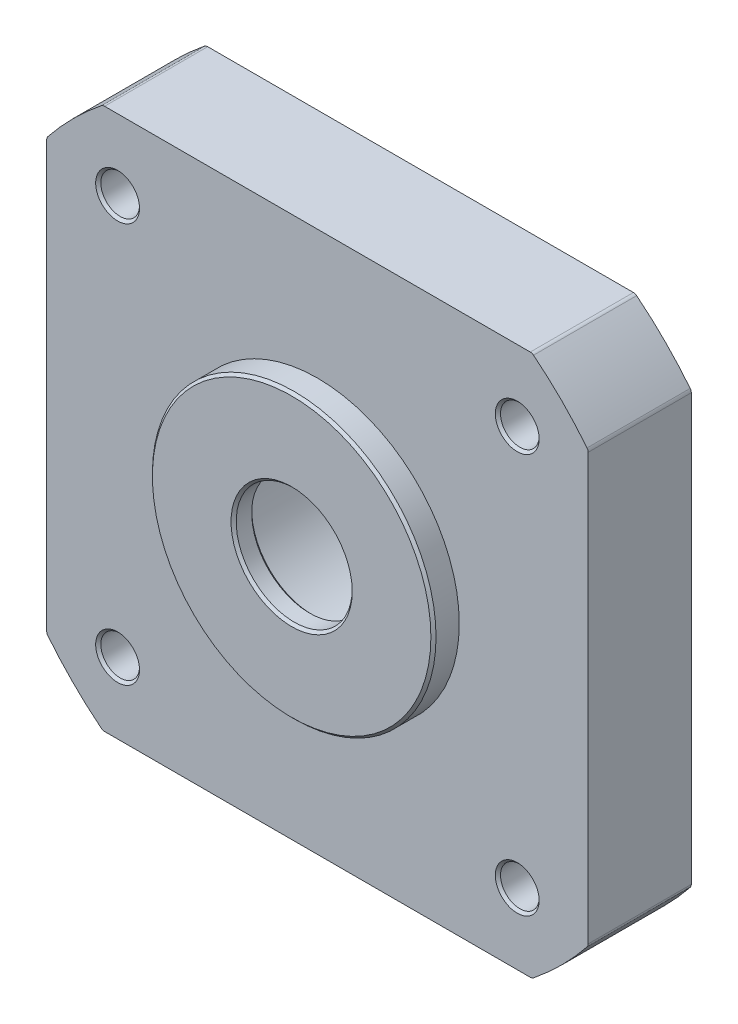
ISO-10303-21;
HEADER;
FILE_DESCRIPTION(('STEP AP214'),'2;1');
FILE_NAME('part.step','',(''),(''),'','','');
FILE_SCHEMA(('AUTOMOTIVE_DESIGN { 1 0 10303 214 1 1 1 1 }'));
ENDSEC;
DATA;
#1=APPLICATION_CONTEXT('core data for automotive mechanical design processes');
#2=APPLICATION_PROTOCOL_DEFINITION('international standard','automotive_design',2000,#1);
#3=PRODUCT_CONTEXT('',#1,'mechanical');
#4=PRODUCT('Part','Part','',(#3));
#5=PRODUCT_RELATED_PRODUCT_CATEGORY('part','',(#4));
#6=PRODUCT_DEFINITION_FORMATION('','',#4);
#7=PRODUCT_DEFINITION_CONTEXT('part definition',#1,'design');
#8=PRODUCT_DEFINITION('design','',#6,#7);
#9=PRODUCT_DEFINITION_SHAPE('','',#8);
#10=(LENGTH_UNIT() NAMED_UNIT(*) SI_UNIT(.MILLI.,.METRE.));
#11=(NAMED_UNIT(*) PLANE_ANGLE_UNIT() SI_UNIT($,.RADIAN.));
#12=(NAMED_UNIT(*) SI_UNIT($,.STERADIAN.) SOLID_ANGLE_UNIT());
#13=UNCERTAINTY_MEASURE_WITH_UNIT(LENGTH_MEASURE(1.E-05),#10,'distance_accuracy_value','');
#14=(GEOMETRIC_REPRESENTATION_CONTEXT(3) GLOBAL_UNCERTAINTY_ASSIGNED_CONTEXT((#13)) GLOBAL_UNIT_ASSIGNED_CONTEXT((#10,
#11,#12)) REPRESENTATION_CONTEXT('',''));
#15=CARTESIAN_POINT('',(0.,0.,0.));
#16=DIRECTION('',(0.,0.,1.));
#17=DIRECTION('',(1.,0.,0.));
#18=AXIS2_PLACEMENT_3D('',#15,#16,#17);
#19=CARTESIAN_POINT('',(0.,0.,8.));
#20=DIRECTION('',(0.,0.,-1.));
#21=DIRECTION('',(1.,0.,0.));
#22=AXIS2_PLACEMENT_3D('',#19,#20,#21);
#23=CYLINDRICAL_SURFACE('',#22,4.5);
#24=DIRECTION('',(0.,0.,1.));
#25=VECTOR('',#24,1.);
#26=CARTESIAN_POINT('',(4.5,0.,8.));
#27=LINE('',#26,#25);
#28=CARTESIAN_POINT('',(4.5,0.,8.6));
#29=VERTEX_POINT('',#28);
#30=CARTESIAN_POINT('',(4.5,0.,9.8));
#31=VERTEX_POINT('',#30);
#32=EDGE_CURVE('E11',#29,#31,#27,.T.);
#33=ORIENTED_EDGE('',*,*,#32,.F.);
#34=CARTESIAN_POINT('',(0.,0.,8.6));
#35=DIRECTION('',(0.,0.,-1.));
#36=DIRECTION('',(1.,0.,0.));
#37=AXIS2_PLACEMENT_3D('',#34,#35,#36);
#38=CIRCLE('',#37,4.5);
#39=EDGE_CURVE('E26',#29,#29,#38,.T.);
#40=ORIENTED_EDGE('',*,*,#39,.T.);
#41=ORIENTED_EDGE('',*,*,#32,.T.);
#42=CARTESIAN_POINT('',(0.,0.,9.8));
#43=DIRECTION('',(0.,0.,1.));
#44=DIRECTION('',(1.,0.,0.));
#45=AXIS2_PLACEMENT_3D('',#42,#43,#44);
#46=CIRCLE('',#45,4.5);
#47=EDGE_CURVE('E508',#31,#31,#46,.T.);
#48=ORIENTED_EDGE('',*,*,#47,.T.);
#49=EDGE_LOOP('',(#33,#40,#41,#48));
#50=FACE_BOUND('',#49,.T.);
#51=ADVANCED_FACE('F17',(#50),#23,.F.);
#52=CARTESIAN_POINT('',(0.,0.,8.6));
#53=DIRECTION('',(0.,0.,-1.));
#54=DIRECTION('',(1.,0.,0.));
#55=AXIS2_PLACEMENT_3D('',#52,#53,#54);
#56=CONICAL_SURFACE('',#55,4.5,0.785398163397);
#57=DIRECTION('',(-0.707106781186548,0.,0.707106781186548));
#58=VECTOR('',#57,1.);
#59=CARTESIAN_POINT('',(4.5,0.,8.6));
#60=LINE('',#59,#58);
#61=CARTESIAN_POINT('',(4.7,0.,8.4));
#62=VERTEX_POINT('',#61);
#63=EDGE_CURVE('E504',#62,#29,#60,.T.);
#64=ORIENTED_EDGE('',*,*,#63,.F.);
#65=CARTESIAN_POINT('',(0.,0.,8.4));
#66=DIRECTION('',(0.,0.,-1.));
#67=DIRECTION('',(1.,0.,0.));
#68=AXIS2_PLACEMENT_3D('',#65,#66,#67);
#69=CIRCLE('',#68,4.7);
#70=EDGE_CURVE('E436',#62,#62,#69,.T.);
#71=ORIENTED_EDGE('',*,*,#70,.T.);
#72=ORIENTED_EDGE('',*,*,#63,.T.);
#73=ORIENTED_EDGE('',*,*,#39,.F.);
#74=EDGE_LOOP('',(#64,#71,#72,#73));
#75=FACE_BOUND('',#74,.T.);
#76=ADVANCED_FACE('F19',(#75),#56,.F.);
#77=CARTESIAN_POINT('',(0.,0.,9.8));
#78=DIRECTION('',(0.,0.,1.));
#79=DIRECTION('',(1.,0.,0.));
#80=AXIS2_PLACEMENT_3D('',#77,#78,#79);
#81=CONICAL_SURFACE('',#80,4.5,0.785398163397);
#82=DIRECTION('',(-0.707106781186548,0.,-0.707106781186548));
#83=VECTOR('',#82,1.);
#84=CARTESIAN_POINT('',(4.5,0.,9.8));
#85=LINE('',#84,#83);
#86=CARTESIAN_POINT('',(4.7,0.,10.));
#87=VERTEX_POINT('',#86);
#88=EDGE_CURVE('E440',#87,#31,#85,.T.);
#89=ORIENTED_EDGE('',*,*,#88,.F.);
#90=CARTESIAN_POINT('',(0.,0.,10.));
#91=DIRECTION('',(0.,0.,1.));
#92=DIRECTION('',(1.,0.,0.));
#93=AXIS2_PLACEMENT_3D('',#90,#91,#92);
#94=CIRCLE('',#93,4.7);
#95=EDGE_CURVE('E296',#87,#87,#94,.T.);
#96=ORIENTED_EDGE('',*,*,#95,.T.);
#97=ORIENTED_EDGE('',*,*,#88,.T.);
#98=ORIENTED_EDGE('',*,*,#47,.F.);
#99=EDGE_LOOP('',(#89,#96,#97,#98));
#100=FACE_BOUND('',#99,.T.);
#101=ADVANCED_FACE('F539',(#100),#81,.F.);
#102=CARTESIAN_POINT('',(0.,0.,8.4));
#103=DIRECTION('',(0.,0.,1.));
#104=DIRECTION('',(1.,0.,0.));
#105=AXIS2_PLACEMENT_3D('',#102,#103,#104);
#106=PLANE('',#105);
#107=CARTESIAN_POINT('',(0.,0.,8.4));
#108=DIRECTION('',(0.,0.,1.));
#109=DIRECTION('',(1.,0.,0.));
#110=AXIS2_PLACEMENT_3D('',#107,#108,#109);
#111=CIRCLE('',#110,8.);
#112=CARTESIAN_POINT('',(8.,0.,8.4));
#113=VERTEX_POINT('',#112);
#114=EDGE_CURVE('E293',#113,#113,#111,.T.);
#115=ORIENTED_EDGE('',*,*,#114,.F.);
#116=EDGE_LOOP('',(#115));
#117=FACE_BOUND('',#116,.T.);
#118=ORIENTED_EDGE('',*,*,#70,.F.);
#119=EDGE_LOOP('',(#118));
#120=FACE_BOUND('',#119,.T.);
#121=ADVANCED_FACE('F536',(#117,#120),#106,.F.);
#122=CARTESIAN_POINT('',(0.,0.,10.));
#123=DIRECTION('',(0.,0.,1.));
#124=DIRECTION('',(1.,0.,0.));
#125=AXIS2_PLACEMENT_3D('',#122,#123,#124);
#126=PLANE('',#125);
#127=ORIENTED_EDGE('',*,*,#95,.F.);
#128=EDGE_LOOP('',(#127));
#129=FACE_BOUND('',#128,.T.);
#130=CARTESIAN_POINT('',(0.,0.,10.));
#131=DIRECTION('',(0.,0.,1.));
#132=DIRECTION('',(1.,0.,0.));
#133=AXIS2_PLACEMENT_3D('',#130,#131,#132);
#134=CIRCLE('',#133,10.8);
#135=CARTESIAN_POINT('',(10.8,0.,10.));
#136=VERTEX_POINT('',#135);
#137=EDGE_CURVE('E417',#136,#136,#134,.T.);
#138=ORIENTED_EDGE('',*,*,#137,.T.);
#139=EDGE_LOOP('',(#138));
#140=FACE_BOUND('',#139,.T.);
#141=ADVANCED_FACE('F538',(#129,#140),#126,.T.);
#142=CARTESIAN_POINT('',(0.,0.,0.));
#143=DIRECTION('',(0.,0.,-1.));
#144=DIRECTION('',(1.,0.,0.));
#145=AXIS2_PLACEMENT_3D('',#142,#143,#144);
#146=CYLINDRICAL_SURFACE('',#145,8.);
#147=DIRECTION('',(0.,0.,1.));
#148=VECTOR('',#147,1.);
#149=CARTESIAN_POINT('',(8.,0.,0.));
#150=LINE('',#149,#148);
#151=CARTESIAN_POINT('',(8.,0.,0.));
#152=VERTEX_POINT('',#151);
#153=EDGE_CURVE('E297',#152,#113,#150,.T.);
#154=ORIENTED_EDGE('',*,*,#153,.T.);
#155=ORIENTED_EDGE('',*,*,#114,.T.);
#156=ORIENTED_EDGE('',*,*,#153,.F.);
#157=CARTESIAN_POINT('',(0.,0.,0.));
#158=DIRECTION('',(0.,0.,1.));
#159=DIRECTION('',(1.,0.,0.));
#160=AXIS2_PLACEMENT_3D('',#157,#158,#159);
#161=CIRCLE('',#160,8.);
#162=EDGE_CURVE('E291',#152,#152,#161,.T.);
#163=ORIENTED_EDGE('',*,*,#162,.F.);
#164=EDGE_LOOP('',(#154,#155,#156,#163));
#165=FACE_BOUND('',#164,.T.);
#166=ADVANCED_FACE('F547',(#165),#146,.F.);
#167=CARTESIAN_POINT('',(15.5,-15.5,0.));
#168=DIRECTION('',(0.,0.,-1.));
#169=DIRECTION('',(1.,0.,0.));
#170=AXIS2_PLACEMENT_3D('',#167,#168,#169);
#171=CYLINDRICAL_SURFACE('',#170,1.5);
#172=DIRECTION('',(0.,0.,1.));
#173=VECTOR('',#172,1.);
#174=CARTESIAN_POINT('',(17.,-15.5,0.));
#175=LINE('',#174,#173);
#176=CARTESIAN_POINT('',(17.,-15.5,0.));
#177=VERTEX_POINT('',#176);
#178=CARTESIAN_POINT('',(17.,-15.5,7.8));
#179=VERTEX_POINT('',#178);
#180=EDGE_CURVE('E359',#177,#179,#175,.T.);
#181=ORIENTED_EDGE('',*,*,#180,.T.);
#182=CARTESIAN_POINT('',(15.5,-15.5,7.8));
#183=DIRECTION('',(0.,0.,1.));
#184=DIRECTION('',(1.,0.,0.));
#185=AXIS2_PLACEMENT_3D('',#182,#183,#184);
#186=CIRCLE('',#185,1.5);
#187=EDGE_CURVE('E490',#179,#179,#186,.T.);
#188=ORIENTED_EDGE('',*,*,#187,.T.);
#189=ORIENTED_EDGE('',*,*,#180,.F.);
#190=CARTESIAN_POINT('',(15.5,-15.5,0.));
#191=DIRECTION('',(0.,0.,1.));
#192=DIRECTION('',(1.,0.,0.));
#193=AXIS2_PLACEMENT_3D('',#190,#191,#192);
#194=CIRCLE('',#193,1.5);
#195=EDGE_CURVE('E489',#177,#177,#194,.T.);
#196=ORIENTED_EDGE('',*,*,#195,.F.);
#197=EDGE_LOOP('',(#181,#188,#189,#196));
#198=FACE_BOUND('',#197,.T.);
#199=ADVANCED_FACE('F559',(#198),#171,.F.);
#200=CARTESIAN_POINT('',(-15.5,-15.5,0.));
#201=DIRECTION('',(0.,0.,-1.));
#202=DIRECTION('',(1.,0.,0.));
#203=AXIS2_PLACEMENT_3D('',#200,#201,#202);
#204=CYLINDRICAL_SURFACE('',#203,1.5);
#205=DIRECTION('',(0.,0.,1.));
#206=VECTOR('',#205,1.);
#207=CARTESIAN_POINT('',(-14.,-15.5,0.));
#208=LINE('',#207,#206);
#209=CARTESIAN_POINT('',(-14.,-15.5,0.));
#210=VERTEX_POINT('',#209);
#211=CARTESIAN_POINT('',(-14.,-15.5,7.8));
#212=VERTEX_POINT('',#211);
#213=EDGE_CURVE('E411',#210,#212,#208,.T.);
#214=ORIENTED_EDGE('',*,*,#213,.T.);
#215=CARTESIAN_POINT('',(-15.5,-15.5,7.8));
#216=DIRECTION('',(0.,0.,1.));
#217=DIRECTION('',(1.,0.,0.));
#218=AXIS2_PLACEMENT_3D('',#215,#216,#217);
#219=CIRCLE('',#218,1.5);
#220=EDGE_CURVE('E456',#212,#212,#219,.T.);
#221=ORIENTED_EDGE('',*,*,#220,.T.);
#222=ORIENTED_EDGE('',*,*,#213,.F.);
#223=CARTESIAN_POINT('',(-15.5,-15.5,0.));
#224=DIRECTION('',(0.,0.,1.));
#225=DIRECTION('',(1.,0.,0.));
#226=AXIS2_PLACEMENT_3D('',#223,#224,#225);
#227=CIRCLE('',#226,1.5);
#228=EDGE_CURVE('E485',#210,#210,#227,.T.);
#229=ORIENTED_EDGE('',*,*,#228,.F.);
#230=EDGE_LOOP('',(#214,#221,#222,#229));
#231=FACE_BOUND('',#230,.T.);
#232=ADVANCED_FACE('F566',(#231),#204,.F.);
#233=CARTESIAN_POINT('',(-15.5,15.5,0.));
#234=DIRECTION('',(0.,0.,-1.));
#235=DIRECTION('',(1.,0.,0.));
#236=AXIS2_PLACEMENT_3D('',#233,#234,#235);
#237=CYLINDRICAL_SURFACE('',#236,1.5);
#238=DIRECTION('',(0.,0.,1.));
#239=VECTOR('',#238,1.);
#240=CARTESIAN_POINT('',(-14.,15.5,0.));
#241=LINE('',#240,#239);
#242=CARTESIAN_POINT('',(-14.,15.5,0.));
#243=VERTEX_POINT('',#242);
#244=CARTESIAN_POINT('',(-14.,15.5,7.8));
#245=VERTEX_POINT('',#244);
#246=EDGE_CURVE('E414',#243,#245,#241,.T.);
#247=ORIENTED_EDGE('',*,*,#246,.T.);
#248=CARTESIAN_POINT('',(-15.5,15.5,7.8));
#249=DIRECTION('',(0.,0.,1.));
#250=DIRECTION('',(1.,0.,0.));
#251=AXIS2_PLACEMENT_3D('',#248,#249,#250);
#252=CIRCLE('',#251,1.5);
#253=EDGE_CURVE('E457',#245,#245,#252,.T.);
#254=ORIENTED_EDGE('',*,*,#253,.T.);
#255=ORIENTED_EDGE('',*,*,#246,.F.);
#256=CARTESIAN_POINT('',(-15.5,15.5,0.));
#257=DIRECTION('',(0.,0.,1.));
#258=DIRECTION('',(1.,0.,0.));
#259=AXIS2_PLACEMENT_3D('',#256,#257,#258);
#260=CIRCLE('',#259,1.5);
#261=EDGE_CURVE('E512',#243,#243,#260,.T.);
#262=ORIENTED_EDGE('',*,*,#261,.F.);
#263=EDGE_LOOP('',(#247,#254,#255,#262));
#264=FACE_BOUND('',#263,.T.);
#265=ADVANCED_FACE('F688',(#264),#237,.F.);
#266=CARTESIAN_POINT('',(0.,0.,9.8));
#267=DIRECTION('',(0.,0.,-1.));
#268=DIRECTION('',(1.,0.,0.));
#269=AXIS2_PLACEMENT_3D('',#266,#267,#268);
#270=CONICAL_SURFACE('',#269,11.,0.785398163397);
#271=DIRECTION('',(-0.707106781186548,0.,0.707106781186548));
#272=VECTOR('',#271,1.);
#273=CARTESIAN_POINT('',(11.,0.,9.8));
#274=LINE('',#273,#272);
#275=CARTESIAN_POINT('',(11.,0.,9.8));
#276=VERTEX_POINT('',#275);
#277=EDGE_CURVE('E366',#276,#136,#274,.T.);
#278=ORIENTED_EDGE('',*,*,#277,.F.);
#279=CARTESIAN_POINT('',(0.,0.,9.8));
#280=DIRECTION('',(0.,0.,1.));
#281=DIRECTION('',(1.,0.,0.));
#282=AXIS2_PLACEMENT_3D('',#279,#280,#281);
#283=CIRCLE('',#282,11.);
#284=EDGE_CURVE('E481',#276,#276,#283,.T.);
#285=ORIENTED_EDGE('',*,*,#284,.T.);
#286=ORIENTED_EDGE('',*,*,#277,.T.);
#287=ORIENTED_EDGE('',*,*,#137,.F.);
#288=EDGE_LOOP('',(#278,#285,#286,#287));
#289=FACE_BOUND('',#288,.T.);
#290=ADVANCED_FACE('F666',(#289),#270,.T.);
#291=CARTESIAN_POINT('',(15.5,15.5,0.));
#292=DIRECTION('',(0.,0.,-1.));
#293=DIRECTION('',(1.,0.,0.));
#294=AXIS2_PLACEMENT_3D('',#291,#292,#293);
#295=CYLINDRICAL_SURFACE('',#294,1.5);
#296=DIRECTION('',(0.,0.,1.));
#297=VECTOR('',#296,1.);
#298=CARTESIAN_POINT('',(17.,15.5,0.));
#299=LINE('',#298,#297);
#300=CARTESIAN_POINT('',(17.,15.5,0.));
#301=VERTEX_POINT('',#300);
#302=CARTESIAN_POINT('',(17.,15.5,7.8));
#303=VERTEX_POINT('',#302);
#304=EDGE_CURVE('E290',#301,#303,#299,.T.);
#305=ORIENTED_EDGE('',*,*,#304,.T.);
#306=CARTESIAN_POINT('',(15.5,15.5,7.8));
#307=DIRECTION('',(0.,0.,1.));
#308=DIRECTION('',(1.,0.,0.));
#309=AXIS2_PLACEMENT_3D('',#306,#307,#308);
#310=CIRCLE('',#309,1.5);
#311=EDGE_CURVE('E473',#303,#303,#310,.T.);
#312=ORIENTED_EDGE('',*,*,#311,.T.);
#313=ORIENTED_EDGE('',*,*,#304,.F.);
#314=CARTESIAN_POINT('',(15.5,15.5,0.));
#315=DIRECTION('',(0.,0.,1.));
#316=DIRECTION('',(1.,0.,0.));
#317=AXIS2_PLACEMENT_3D('',#314,#315,#316);
#318=CIRCLE('',#317,1.5);
#319=EDGE_CURVE('E288',#301,#301,#318,.T.);
#320=ORIENTED_EDGE('',*,*,#319,.F.);
#321=EDGE_LOOP('',(#305,#312,#313,#320));
#322=FACE_BOUND('',#321,.T.);
#323=ADVANCED_FACE('F574',(#322),#295,.F.);
#324=CARTESIAN_POINT('',(0.,0.,0.));
#325=DIRECTION('',(0.,0.,1.));
#326=DIRECTION('',(1.,0.,0.));
#327=AXIS2_PLACEMENT_3D('',#324,#325,#326);
#328=PLANE('',#327);
#329=ORIENTED_EDGE('',*,*,#319,.T.);
#330=EDGE_LOOP('',(#329));
#331=FACE_BOUND('',#330,.T.);
#332=ORIENTED_EDGE('',*,*,#162,.T.);
#333=EDGE_LOOP('',(#332));
#334=FACE_BOUND('',#333,.T.);
#335=ORIENTED_EDGE('',*,*,#261,.T.);
#336=EDGE_LOOP('',(#335));
#337=FACE_BOUND('',#336,.T.);
#338=ORIENTED_EDGE('',*,*,#195,.T.);
#339=EDGE_LOOP('',(#338));
#340=FACE_BOUND('',#339,.T.);
#341=ORIENTED_EDGE('',*,*,#228,.T.);
#342=EDGE_LOOP('',(#341));
#343=FACE_BOUND('',#342,.T.);
#344=CARTESIAN_POINT('',(20.599999999996,16.510602654057,0.));
#345=DIRECTION('',(0.,0.,-1.));
#346=DIRECTION('',(0.,-1.,0.));
#347=AXIS2_PLACEMENT_3D('',#344,#345,#346);
#348=CIRCLE('',#347,0.4);
#349=CARTESIAN_POINT('',(20.912121212117,16.760763300331,0.));
#350=VERTEX_POINT('',#349);
#351=CARTESIAN_POINT('',(20.999999999996,16.510602654057,0.));
#352=VERTEX_POINT('',#351);
#353=EDGE_CURVE('E386',#350,#352,#348,.T.);
#354=ORIENTED_EDGE('',*,*,#353,.T.);
#355=DIRECTION('',(0.,-1.,0.));
#356=VECTOR('',#355,1.);
#357=CARTESIAN_POINT('',(20.999999999996,16.650525517237,0.));
#358=LINE('',#357,#356);
#359=CARTESIAN_POINT('',(20.999999999996,-16.51060265405,0.));
#360=VERTEX_POINT('',#359);
#361=EDGE_CURVE('E397',#352,#360,#358,.T.);
#362=ORIENTED_EDGE('',*,*,#361,.T.);
#363=CARTESIAN_POINT('',(20.599999999996,-16.51060265405,0.));
#364=DIRECTION('',(0.,0.,-1.));
#365=DIRECTION('',(0.,-1.,0.));
#366=AXIS2_PLACEMENT_3D('',#363,#364,#365);
#367=CIRCLE('',#366,0.4);
#368=CARTESIAN_POINT('',(20.912121212117,-16.76076330033,0.));
#369=VERTEX_POINT('',#368);
#370=EDGE_CURVE('E310',#360,#369,#367,.T.);
#371=ORIENTED_EDGE('',*,*,#370,.T.);
#372=CARTESIAN_POINT('',(0.,0.,0.));
#373=DIRECTION('',(0.,0.,1.));
#374=DIRECTION('',(1.,0.,0.));
#375=AXIS2_PLACEMENT_3D('',#372,#373,#374);
#376=CIRCLE('',#375,26.8);
#377=CARTESIAN_POINT('',(16.760763300339,-20.91212121211,0.));
#378=VERTEX_POINT('',#377);
#379=EDGE_CURVE('E259',#378,#369,#376,.T.);
#380=ORIENTED_EDGE('',*,*,#379,.F.);
#381=CARTESIAN_POINT('',(16.510602654065,-20.59999999999,0.));
#382=DIRECTION('',(0.,0.,-1.));
#383=DIRECTION('',(0.,-1.,0.));
#384=AXIS2_PLACEMENT_3D('',#381,#382,#383);
#385=CIRCLE('',#384,0.4);
#386=CARTESIAN_POINT('',(16.510602654065,-20.99999999999,0.));
#387=VERTEX_POINT('',#386);
#388=EDGE_CURVE('E443',#378,#387,#385,.T.);
#389=ORIENTED_EDGE('',*,*,#388,.T.);
#390=DIRECTION('',(1.,0.,0.));
#391=VECTOR('',#390,1.);
#392=CARTESIAN_POINT('',(-16.65052551724,-20.99999999999,0.));
#393=LINE('',#392,#391);
#394=CARTESIAN_POINT('',(-16.51060265406,-20.99999999999,0.));
#395=VERTEX_POINT('',#394);
#396=EDGE_CURVE('E329',#395,#387,#393,.T.);
#397=ORIENTED_EDGE('',*,*,#396,.F.);
#398=CARTESIAN_POINT('',(-16.51060265406,-20.59999999999,0.));
#399=DIRECTION('',(0.,0.,-1.));
#400=DIRECTION('',(0.,-1.,0.));
#401=AXIS2_PLACEMENT_3D('',#398,#399,#400);
#402=CIRCLE('',#401,0.4);
#403=CARTESIAN_POINT('',(-16.76076330033,-20.91212121211,0.));
#404=VERTEX_POINT('',#403);
#405=EDGE_CURVE('E369',#395,#404,#402,.T.);
#406=ORIENTED_EDGE('',*,*,#405,.T.);
#407=CARTESIAN_POINT('',(0.,0.,0.));
#408=DIRECTION('',(0.,0.,1.));
#409=DIRECTION('',(1.,0.,0.));
#410=AXIS2_PLACEMENT_3D('',#407,#408,#409);
#411=CIRCLE('',#410,26.8);
#412=CARTESIAN_POINT('',(-20.91212121211,-16.76076330033,0.));
#413=VERTEX_POINT('',#412);
#414=EDGE_CURVE('E301',#413,#404,#411,.T.);
#415=ORIENTED_EDGE('',*,*,#414,.F.);
#416=CARTESIAN_POINT('',(-20.59999999999,-16.51060265405,0.));
#417=DIRECTION('',(0.,0.,1.));
#418=DIRECTION('',(0.,-1.,0.));
#419=AXIS2_PLACEMENT_3D('',#416,#417,#418);
#420=CIRCLE('',#419,0.4);
#421=CARTESIAN_POINT('',(-20.99999999999,-16.51060265405,0.));
#422=VERTEX_POINT('',#421);
#423=EDGE_CURVE('E302',#422,#413,#420,.T.);
#424=ORIENTED_EDGE('',*,*,#423,.F.);
#425=DIRECTION('',(0.,-1.,0.));
#426=VECTOR('',#425,1.);
#427=CARTESIAN_POINT('',(-20.99999999999,16.650525517237,0.));
#428=LINE('',#427,#426);
#429=CARTESIAN_POINT('',(-20.99999999999,16.510602654057,0.));
#430=VERTEX_POINT('',#429);
#431=EDGE_CURVE('E432',#430,#422,#428,.T.);
#432=ORIENTED_EDGE('',*,*,#431,.F.);
#433=CARTESIAN_POINT('',(-20.59999999999,16.510602654057,0.));
#434=DIRECTION('',(0.,0.,1.));
#435=DIRECTION('',(0.,-1.,0.));
#436=AXIS2_PLACEMENT_3D('',#433,#434,#435);
#437=CIRCLE('',#436,0.4);
#438=CARTESIAN_POINT('',(-20.91212121211,16.760763300331,0.));
#439=VERTEX_POINT('',#438);
#440=EDGE_CURVE('E306',#439,#430,#437,.T.);
#441=ORIENTED_EDGE('',*,*,#440,.F.);
#442=CARTESIAN_POINT('',(0.,0.,0.));
#443=DIRECTION('',(0.,0.,1.));
#444=DIRECTION('',(1.,0.,0.));
#445=AXIS2_PLACEMENT_3D('',#442,#443,#444);
#446=CIRCLE('',#445,26.8);
#447=CARTESIAN_POINT('',(-16.76076330033,20.912121212111,0.));
#448=VERTEX_POINT('',#447);
#449=EDGE_CURVE('E255',#448,#439,#446,.T.);
#450=ORIENTED_EDGE('',*,*,#449,.F.);
#451=CARTESIAN_POINT('',(-16.51060265406,20.59999999999,0.));
#452=DIRECTION('',(0.,0.,1.));
#453=DIRECTION('',(0.,-1.,0.));
#454=AXIS2_PLACEMENT_3D('',#451,#452,#453);
#455=CIRCLE('',#454,0.4);
#456=CARTESIAN_POINT('',(-16.51060265406,20.99999999999,0.));
#457=VERTEX_POINT('',#456);
#458=EDGE_CURVE('E410',#457,#448,#455,.T.);
#459=ORIENTED_EDGE('',*,*,#458,.F.);
#460=DIRECTION('',(1.,0.,0.));
#461=VECTOR('',#460,1.);
#462=CARTESIAN_POINT('',(-16.65052551724,20.99999999999,0.));
#463=LINE('',#462,#461);
#464=CARTESIAN_POINT('',(16.510602654065,20.99999999999,0.));
#465=VERTEX_POINT('',#464);
#466=EDGE_CURVE('E332',#457,#465,#463,.T.);
#467=ORIENTED_EDGE('',*,*,#466,.T.);
#468=CARTESIAN_POINT('',(16.510602654065,20.59999999999,0.));
#469=DIRECTION('',(0.,0.,1.));
#470=DIRECTION('',(0.,-1.,0.));
#471=AXIS2_PLACEMENT_3D('',#468,#469,#470);
#472=CIRCLE('',#471,0.4);
#473=CARTESIAN_POINT('',(16.760763300339,20.912121212111,0.));
#474=VERTEX_POINT('',#473);
#475=EDGE_CURVE('E390',#474,#465,#472,.T.);
#476=ORIENTED_EDGE('',*,*,#475,.F.);
#477=CARTESIAN_POINT('',(0.,0.,0.));
#478=DIRECTION('',(0.,0.,1.));
#479=DIRECTION('',(1.,0.,0.));
#480=AXIS2_PLACEMENT_3D('',#477,#478,#479);
#481=CIRCLE('',#480,26.8);
#482=EDGE_CURVE('E379',#350,#474,#481,.T.);
#483=ORIENTED_EDGE('',*,*,#482,.F.);
#484=EDGE_LOOP('',(#354,#362,#371,#380,#389,#397,#406,#415,#424,#432,#441,#450,#459,#467,#476,#483));
#485=FACE_BOUND('',#484,.T.);
#486=ADVANCED_FACE('F570',(#331,#334,#337,#340,#343,#485),#328,.F.);
#487=CARTESIAN_POINT('',(15.5,-15.5,7.8));
#488=DIRECTION('',(0.,0.,1.));
#489=DIRECTION('',(1.,0.,0.));
#490=AXIS2_PLACEMENT_3D('',#487,#488,#489);
#491=CONICAL_SURFACE('',#490,1.5,0.785398163397);
#492=DIRECTION('',(-0.707106781186548,0.,-0.707106781186548));
#493=VECTOR('',#492,1.);
#494=CARTESIAN_POINT('',(17.,-15.5,7.8));
#495=LINE('',#494,#493);
#496=CARTESIAN_POINT('',(17.2,-15.5,8.));
#497=VERTEX_POINT('',#496);
#498=EDGE_CURVE('E494',#497,#179,#495,.T.);
#499=ORIENTED_EDGE('',*,*,#498,.F.);
#500=CARTESIAN_POINT('',(15.5,-15.5,8.));
#501=DIRECTION('',(0.,0.,1.));
#502=DIRECTION('',(1.,0.,0.));
#503=AXIS2_PLACEMENT_3D('',#500,#501,#502);
#504=CIRCLE('',#503,1.7);
#505=EDGE_CURVE('E349',#497,#497,#504,.T.);
#506=ORIENTED_EDGE('',*,*,#505,.T.);
#507=ORIENTED_EDGE('',*,*,#498,.T.);
#508=ORIENTED_EDGE('',*,*,#187,.F.);
#509=EDGE_LOOP('',(#499,#506,#507,#508));
#510=FACE_BOUND('',#509,.T.);
#511=ADVANCED_FACE('F573',(#510),#491,.F.);
#512=CARTESIAN_POINT('',(-15.5,-15.5,7.8));
#513=DIRECTION('',(0.,0.,1.));
#514=DIRECTION('',(1.,0.,0.));
#515=AXIS2_PLACEMENT_3D('',#512,#513,#514);
#516=CONICAL_SURFACE('',#515,1.5,0.785398163397);
#517=DIRECTION('',(-0.707106781186548,0.,-0.707106781186548));
#518=VECTOR('',#517,1.);
#519=CARTESIAN_POINT('',(-14.,-15.5,7.8));
#520=LINE('',#519,#518);
#521=CARTESIAN_POINT('',(-13.8,-15.5,8.));
#522=VERTEX_POINT('',#521);
#523=EDGE_CURVE('E452',#522,#212,#520,.T.);
#524=ORIENTED_EDGE('',*,*,#523,.F.);
#525=CARTESIAN_POINT('',(-15.5,-15.5,8.));
#526=DIRECTION('',(0.,0.,1.));
#527=DIRECTION('',(1.,0.,0.));
#528=AXIS2_PLACEMENT_3D('',#525,#526,#527);
#529=CIRCLE('',#528,1.7);
#530=EDGE_CURVE('E363',#522,#522,#529,.T.);
#531=ORIENTED_EDGE('',*,*,#530,.T.);
#532=ORIENTED_EDGE('',*,*,#523,.T.);
#533=ORIENTED_EDGE('',*,*,#220,.F.);
#534=EDGE_LOOP('',(#524,#531,#532,#533));
#535=FACE_BOUND('',#534,.T.);
#536=ADVANCED_FACE('F700',(#535),#516,.F.);
#537=CARTESIAN_POINT('',(-15.5,15.5,7.8));
#538=DIRECTION('',(0.,0.,1.));
#539=DIRECTION('',(1.,0.,0.));
#540=AXIS2_PLACEMENT_3D('',#537,#538,#539);
#541=CONICAL_SURFACE('',#540,1.5,0.785398163397);
#542=DIRECTION('',(-0.707106781186548,0.,-0.707106781186548));
#543=VECTOR('',#542,1.);
#544=CARTESIAN_POINT('',(-14.,15.5,7.8));
#545=LINE('',#544,#543);
#546=CARTESIAN_POINT('',(-13.8,15.5,8.));
#547=VERTEX_POINT('',#546);
#548=EDGE_CURVE('E466',#547,#245,#545,.T.);
#549=ORIENTED_EDGE('',*,*,#548,.F.);
#550=CARTESIAN_POINT('',(-15.5,15.5,8.));
#551=DIRECTION('',(0.,0.,1.));
#552=DIRECTION('',(1.,0.,0.));
#553=AXIS2_PLACEMENT_3D('',#550,#551,#552);
#554=CIRCLE('',#553,1.7);
#555=EDGE_CURVE('E316',#547,#547,#554,.T.);
#556=ORIENTED_EDGE('',*,*,#555,.T.);
#557=ORIENTED_EDGE('',*,*,#548,.T.);
#558=ORIENTED_EDGE('',*,*,#253,.F.);
#559=EDGE_LOOP('',(#549,#556,#557,#558));
#560=FACE_BOUND('',#559,.T.);
#561=ADVANCED_FACE('F706',(#560),#541,.F.);
#562=CARTESIAN_POINT('',(0.,0.,8.));
#563=DIRECTION('',(0.,0.,-1.));
#564=DIRECTION('',(1.,0.,0.));
#565=AXIS2_PLACEMENT_3D('',#562,#563,#564);
#566=CYLINDRICAL_SURFACE('',#565,11.);
#567=CARTESIAN_POINT('',(0.,0.,8.));
#568=DIRECTION('',(0.,0.,1.));
#569=DIRECTION('',(1.,0.,0.));
#570=AXIS2_PLACEMENT_3D('',#567,#568,#569);
#571=CIRCLE('',#570,11.);
#572=CARTESIAN_POINT('',(11.,0.,8.));
#573=VERTEX_POINT('',#572);
#574=EDGE_CURVE('E312',#573,#573,#571,.T.);
#575=ORIENTED_EDGE('',*,*,#574,.T.);
#576=DIRECTION('',(0.,0.,1.));
#577=VECTOR('',#576,1.);
#578=CARTESIAN_POINT('',(11.,0.,8.));
#579=LINE('',#578,#577);
#580=EDGE_CURVE('E477',#573,#276,#579,.T.);
#581=ORIENTED_EDGE('',*,*,#580,.T.);
#582=ORIENTED_EDGE('',*,*,#284,.F.);
#583=ORIENTED_EDGE('',*,*,#580,.F.);
#584=EDGE_LOOP('',(#575,#581,#582,#583));
#585=FACE_BOUND('',#584,.T.);
#586=ADVANCED_FACE('F669',(#585),#566,.T.);
#587=CARTESIAN_POINT('',(15.5,15.5,7.8));
#588=DIRECTION('',(0.,0.,1.));
#589=DIRECTION('',(1.,0.,0.));
#590=AXIS2_PLACEMENT_3D('',#587,#588,#589);
#591=CONICAL_SURFACE('',#590,1.5,0.785398163397);
#592=DIRECTION('',(-0.707106781186548,0.,-0.707106781186548));
#593=VECTOR('',#592,1.);
#594=CARTESIAN_POINT('',(17.,15.5,7.8));
#595=LINE('',#594,#593);
#596=CARTESIAN_POINT('',(17.2,15.5,8.));
#597=VERTEX_POINT('',#596);
#598=EDGE_CURVE('E404',#597,#303,#595,.T.);
#599=ORIENTED_EDGE('',*,*,#598,.F.);
#600=CARTESIAN_POINT('',(15.5,15.5,8.));
#601=DIRECTION('',(0.,0.,1.));
#602=DIRECTION('',(1.,0.,0.));
#603=AXIS2_PLACEMENT_3D('',#600,#601,#602);
#604=CIRCLE('',#603,1.7);
#605=EDGE_CURVE('E317',#597,#597,#604,.T.);
#606=ORIENTED_EDGE('',*,*,#605,.T.);
#607=ORIENTED_EDGE('',*,*,#598,.T.);
#608=ORIENTED_EDGE('',*,*,#311,.F.);
#609=EDGE_LOOP('',(#599,#606,#607,#608));
#610=FACE_BOUND('',#609,.T.);
#611=ADVANCED_FACE('F679',(#610),#591,.F.);
#612=CARTESIAN_POINT('',(0.,0.,0.));
#613=DIRECTION('',(0.,0.,-1.));
#614=DIRECTION('',(1.,0.,0.));
#615=AXIS2_PLACEMENT_3D('',#612,#613,#614);
#616=CYLINDRICAL_SURFACE('',#615,26.8);
#617=DIRECTION('',(0.,0.,1.));
#618=VECTOR('',#617,1.);
#619=CARTESIAN_POINT('',(-16.76076330033,-20.91212121211,0.));
#620=LINE('',#619,#618);
#621=CARTESIAN_POINT('',(-16.76076330033,-20.91212121211,8.));
#622=VERTEX_POINT('',#621);
#623=EDGE_CURVE('E429',#404,#622,#620,.T.);
#624=ORIENTED_EDGE('',*,*,#623,.T.);
#625=CARTESIAN_POINT('',(0.,0.,8.));
#626=DIRECTION('',(0.,0.,1.));
#627=DIRECTION('',(1.,0.,0.));
#628=AXIS2_PLACEMENT_3D('',#625,#626,#627);
#629=CIRCLE('',#628,26.8);
#630=CARTESIAN_POINT('',(-20.91212121211,-16.76076330033,8.));
#631=VERTEX_POINT('',#630);
#632=EDGE_CURVE('E623',#631,#622,#629,.T.);
#633=ORIENTED_EDGE('',*,*,#632,.F.);
#634=DIRECTION('',(0.,0.,1.));
#635=VECTOR('',#634,1.);
#636=CARTESIAN_POINT('',(-20.91212121211,-16.76076330033,0.));
#637=LINE('',#636,#635);
#638=EDGE_CURVE('E298',#413,#631,#637,.T.);
#639=ORIENTED_EDGE('',*,*,#638,.F.);
#640=ORIENTED_EDGE('',*,*,#414,.T.);
#641=EDGE_LOOP('',(#624,#633,#639,#640));
#642=FACE_BOUND('',#641,.T.);
#643=ADVANCED_FACE('F622',(#642),#616,.T.);
#644=CARTESIAN_POINT('',(-20.59999999999,-16.51060265405,0.));
#645=DIRECTION('',(0.,0.,1.));
#646=DIRECTION('',(-1.,0.,0.));
#647=AXIS2_PLACEMENT_3D('',#644,#645,#646);
#648=CYLINDRICAL_SURFACE('',#647,0.4);
#649=ORIENTED_EDGE('',*,*,#423,.T.);
#650=ORIENTED_EDGE('',*,*,#638,.T.);
#651=CARTESIAN_POINT('',(-20.59999999999,-16.51060265405,8.));
#652=DIRECTION('',(0.,0.,1.));
#653=DIRECTION('',(0.,-1.,0.));
#654=AXIS2_PLACEMENT_3D('',#651,#652,#653);
#655=CIRCLE('',#654,0.4);
#656=CARTESIAN_POINT('',(-20.99999999999,-16.51060265405,8.));
#657=VERTEX_POINT('',#656);
#658=EDGE_CURVE('E320',#657,#631,#655,.T.);
#659=ORIENTED_EDGE('',*,*,#658,.F.);
#660=DIRECTION('',(0.,0.,1.));
#661=VECTOR('',#660,1.);
#662=CARTESIAN_POINT('',(-20.99999999999,-16.51060265405,0.));
#663=LINE('',#662,#661);
#664=EDGE_CURVE('E451',#422,#657,#663,.T.);
#665=ORIENTED_EDGE('',*,*,#664,.F.);
#666=EDGE_LOOP('',(#649,#650,#659,#665));
#667=FACE_BOUND('',#666,.T.);
#668=ADVANCED_FACE('F628',(#667),#648,.T.);
#669=CARTESIAN_POINT('',(-16.51060265406,-20.59999999999,0.));
#670=DIRECTION('',(0.,0.,1.));
#671=DIRECTION('',(0.,-1.,0.));
#672=AXIS2_PLACEMENT_3D('',#669,#670,#671);
#673=CYLINDRICAL_SURFACE('',#672,0.4);
#674=DIRECTION('',(0.,0.,1.));
#675=VECTOR('',#674,1.);
#676=CARTESIAN_POINT('',(-16.51060265406,-20.99999999999,0.));
#677=LINE('',#676,#675);
#678=CARTESIAN_POINT('',(-16.51060265406,-20.99999999999,8.));
#679=VERTEX_POINT('',#678);
#680=EDGE_CURVE('E305',#395,#679,#677,.T.);
#681=ORIENTED_EDGE('',*,*,#680,.T.);
#682=CARTESIAN_POINT('',(-16.51060265406,-20.59999999999,8.));
#683=DIRECTION('',(0.,0.,-1.));
#684=DIRECTION('',(0.,-1.,0.));
#685=AXIS2_PLACEMENT_3D('',#682,#683,#684);
#686=CIRCLE('',#685,0.4);
#687=EDGE_CURVE('E618',#679,#622,#686,.T.);
#688=ORIENTED_EDGE('',*,*,#687,.T.);
#689=ORIENTED_EDGE('',*,*,#623,.F.);
#690=ORIENTED_EDGE('',*,*,#405,.F.);
#691=EDGE_LOOP('',(#681,#688,#689,#690));
#692=FACE_BOUND('',#691,.T.);
#693=ADVANCED_FACE('F617',(#692),#673,.T.);
#694=CARTESIAN_POINT('',(-20.99999999999,16.650525517237,0.));
#695=DIRECTION('',(1.,0.,0.));
#696=DIRECTION('',(0.,1.,0.));
#697=AXIS2_PLACEMENT_3D('',#694,#695,#696);
#698=PLANE('',#697);
#699=ORIENTED_EDGE('',*,*,#664,.T.);
#700=DIRECTION('',(0.,-1.,0.));
#701=VECTOR('',#700,1.);
#702=CARTESIAN_POINT('',(-20.99999999999,16.650525517237,8.));
#703=LINE('',#702,#701);
#704=CARTESIAN_POINT('',(-20.99999999999,16.510602654057,8.));
#705=VERTEX_POINT('',#704);
#706=EDGE_CURVE('E270',#705,#657,#703,.T.);
#707=ORIENTED_EDGE('',*,*,#706,.F.);
#708=DIRECTION('',(0.,0.,1.));
#709=VECTOR('',#708,1.);
#710=CARTESIAN_POINT('',(-20.99999999999,16.510602654057,0.));
#711=LINE('',#710,#709);
#712=EDGE_CURVE('E265',#430,#705,#711,.T.);
#713=ORIENTED_EDGE('',*,*,#712,.F.);
#714=ORIENTED_EDGE('',*,*,#431,.T.);
#715=EDGE_LOOP('',(#699,#707,#713,#714));
#716=FACE_BOUND('',#715,.T.);
#717=ADVANCED_FACE('F630',(#716),#698,.F.);
#718=CARTESIAN_POINT('',(-16.65052551724,-20.99999999999,0.));
#719=DIRECTION('',(0.,1.,0.));
#720=DIRECTION('',(1.,0.,0.));
#721=AXIS2_PLACEMENT_3D('',#718,#719,#720);
#722=PLANE('',#721);
#723=DIRECTION('',(0.,0.,1.));
#724=VECTOR('',#723,1.);
#725=CARTESIAN_POINT('',(16.510602654065,-20.99999999999,0.));
#726=LINE('',#725,#724);
#727=CARTESIAN_POINT('',(16.510602654065,-20.99999999999,8.));
#728=VERTEX_POINT('',#727);
#729=EDGE_CURVE('E435',#387,#728,#726,.T.);
#730=ORIENTED_EDGE('',*,*,#729,.T.);
#731=DIRECTION('',(1.,0.,0.));
#732=VECTOR('',#731,1.);
#733=CARTESIAN_POINT('',(-16.65052551724,-20.99999999999,8.));
#734=LINE('',#733,#732);
#735=EDGE_CURVE('E326',#679,#728,#734,.T.);
#736=ORIENTED_EDGE('',*,*,#735,.F.);
#737=ORIENTED_EDGE('',*,*,#680,.F.);
#738=ORIENTED_EDGE('',*,*,#396,.T.);
#739=EDGE_LOOP('',(#730,#736,#737,#738));
#740=FACE_BOUND('',#739,.T.);
#741=ADVANCED_FACE('F610',(#740),#722,.F.);
#742=CARTESIAN_POINT('',(-20.59999999999,16.510602654057,0.));
#743=DIRECTION('',(0.,0.,1.));
#744=DIRECTION('',(-0.780303030302921,0.625401615683937,0.));
#745=AXIS2_PLACEMENT_3D('',#742,#743,#744);
#746=CYLINDRICAL_SURFACE('',#745,0.4);
#747=ORIENTED_EDGE('',*,*,#440,.T.);
#748=ORIENTED_EDGE('',*,*,#712,.T.);
#749=CARTESIAN_POINT('',(-20.59999999999,16.510602654057,8.));
#750=DIRECTION('',(0.,0.,1.));
#751=DIRECTION('',(0.,-1.,0.));
#752=AXIS2_PLACEMENT_3D('',#749,#750,#751);
#753=CIRCLE('',#752,0.4);
#754=CARTESIAN_POINT('',(-20.91212121211,16.760763300331,8.));
#755=VERTEX_POINT('',#754);
#756=EDGE_CURVE('E262',#755,#705,#753,.T.);
#757=ORIENTED_EDGE('',*,*,#756,.F.);
#758=DIRECTION('',(0.,0.,1.));
#759=VECTOR('',#758,1.);
#760=CARTESIAN_POINT('',(-20.91212121211,16.760763300331,0.));
#761=LINE('',#760,#759);
#762=EDGE_CURVE('E248',#439,#755,#761,.T.);
#763=ORIENTED_EDGE('',*,*,#762,.F.);
#764=EDGE_LOOP('',(#747,#748,#757,#763));
#765=FACE_BOUND('',#764,.T.);
#766=ADVANCED_FACE('F263',(#765),#746,.T.);
#767=CARTESIAN_POINT('',(16.510602654065,-20.59999999999,0.));
#768=DIRECTION('',(0.,0.,1.));
#769=DIRECTION('',(0.625401615683937,-0.780303030302921,0.));
#770=AXIS2_PLACEMENT_3D('',#767,#768,#769);
#771=CYLINDRICAL_SURFACE('',#770,0.4);
#772=DIRECTION('',(0.,0.,1.));
#773=VECTOR('',#772,1.);
#774=CARTESIAN_POINT('',(16.760763300339,-20.91212121211,0.));
#775=LINE('',#774,#773);
#776=CARTESIAN_POINT('',(16.760763300339,-20.91212121211,8.));
#777=VERTEX_POINT('',#776);
#778=EDGE_CURVE('E424',#378,#777,#775,.T.);
#779=ORIENTED_EDGE('',*,*,#778,.T.);
#780=CARTESIAN_POINT('',(16.510602654065,-20.59999999999,8.));
#781=DIRECTION('',(0.,0.,-1.));
#782=DIRECTION('',(0.,-1.,0.));
#783=AXIS2_PLACEMENT_3D('',#780,#781,#782);
#784=CIRCLE('',#783,0.4);
#785=EDGE_CURVE('E321',#777,#728,#784,.T.);
#786=ORIENTED_EDGE('',*,*,#785,.T.);
#787=ORIENTED_EDGE('',*,*,#729,.F.);
#788=ORIENTED_EDGE('',*,*,#388,.F.);
#789=EDGE_LOOP('',(#779,#786,#787,#788));
#790=FACE_BOUND('',#789,.T.);
#791=ADVANCED_FACE('F606',(#790),#771,.T.);
#792=CARTESIAN_POINT('',(0.,0.,0.));
#793=DIRECTION('',(0.,0.,-1.));
#794=DIRECTION('',(1.,0.,0.));
#795=AXIS2_PLACEMENT_3D('',#792,#793,#794);
#796=CYLINDRICAL_SURFACE('',#795,26.8);
#797=ORIENTED_EDGE('',*,*,#762,.T.);
#798=CARTESIAN_POINT('',(0.,0.,8.));
#799=DIRECTION('',(0.,0.,1.));
#800=DIRECTION('',(1.,0.,0.));
#801=AXIS2_PLACEMENT_3D('',#798,#799,#800);
#802=CIRCLE('',#801,26.8);
#803=CARTESIAN_POINT('',(-16.76076330033,20.912121212111,8.));
#804=VERTEX_POINT('',#803);
#805=EDGE_CURVE('E253',#804,#755,#802,.T.);
#806=ORIENTED_EDGE('',*,*,#805,.F.);
#807=DIRECTION('',(0.,0.,1.));
#808=VECTOR('',#807,1.);
#809=CARTESIAN_POINT('',(-16.76076330033,20.912121212111,0.));
#810=LINE('',#809,#808);
#811=EDGE_CURVE('E421',#448,#804,#810,.T.);
#812=ORIENTED_EDGE('',*,*,#811,.F.);
#813=ORIENTED_EDGE('',*,*,#449,.T.);
#814=EDGE_LOOP('',(#797,#806,#812,#813));
#815=FACE_BOUND('',#814,.T.);
#816=ADVANCED_FACE('F250',(#815),#796,.T.);
#817=CARTESIAN_POINT('',(0.,0.,0.));
#818=DIRECTION('',(0.,0.,-1.));
#819=DIRECTION('',(1.,0.,0.));
#820=AXIS2_PLACEMENT_3D('',#817,#818,#819);
#821=CYLINDRICAL_SURFACE('',#820,26.8);
#822=DIRECTION('',(0.,0.,1.));
#823=VECTOR('',#822,1.);
#824=CARTESIAN_POINT('',(20.912121212117,-16.76076330033,0.));
#825=LINE('',#824,#823);
#826=CARTESIAN_POINT('',(20.912121212117,-16.76076330033,8.));
#827=VERTEX_POINT('',#826);
#828=EDGE_CURVE('E307',#369,#827,#825,.T.);
#829=ORIENTED_EDGE('',*,*,#828,.T.);
#830=CARTESIAN_POINT('',(0.,0.,8.));
#831=DIRECTION('',(0.,0.,1.));
#832=DIRECTION('',(1.,0.,0.));
#833=AXIS2_PLACEMENT_3D('',#830,#831,#832);
#834=CIRCLE('',#833,26.8);
#835=EDGE_CURVE('E325',#777,#827,#834,.T.);
#836=ORIENTED_EDGE('',*,*,#835,.F.);
#837=ORIENTED_EDGE('',*,*,#778,.F.);
#838=ORIENTED_EDGE('',*,*,#379,.T.);
#839=EDGE_LOOP('',(#829,#836,#837,#838));
#840=FACE_BOUND('',#839,.T.);
#841=ADVANCED_FACE('F603',(#840),#821,.T.);
#842=CARTESIAN_POINT('',(-16.51060265406,20.59999999999,0.));
#843=DIRECTION('',(0.,0.,1.));
#844=DIRECTION('',(0.,1.,0.));
#845=AXIS2_PLACEMENT_3D('',#842,#843,#844);
#846=CYLINDRICAL_SURFACE('',#845,0.4);
#847=ORIENTED_EDGE('',*,*,#458,.T.);
#848=ORIENTED_EDGE('',*,*,#811,.T.);
#849=CARTESIAN_POINT('',(-16.51060265406,20.59999999999,8.));
#850=DIRECTION('',(0.,0.,1.));
#851=DIRECTION('',(0.,-1.,0.));
#852=AXIS2_PLACEMENT_3D('',#849,#850,#851);
#853=CIRCLE('',#852,0.4);
#854=CARTESIAN_POINT('',(-16.51060265406,20.99999999999,8.));
#855=VERTEX_POINT('',#854);
#856=EDGE_CURVE('E276',#855,#804,#853,.T.);
#857=ORIENTED_EDGE('',*,*,#856,.F.);
#858=DIRECTION('',(0.,0.,1.));
#859=VECTOR('',#858,1.);
#860=CARTESIAN_POINT('',(-16.51060265406,20.99999999999,0.));
#861=LINE('',#860,#859);
#862=EDGE_CURVE('E311',#457,#855,#861,.T.);
#863=ORIENTED_EDGE('',*,*,#862,.F.);
#864=EDGE_LOOP('',(#847,#848,#857,#863));
#865=FACE_BOUND('',#864,.T.);
#866=ADVANCED_FACE('F633',(#865),#846,.T.);
#867=CARTESIAN_POINT('',(20.599999999996,-16.51060265405,0.));
#868=DIRECTION('',(0.,0.,1.));
#869=DIRECTION('',(1.,0.,0.));
#870=AXIS2_PLACEMENT_3D('',#867,#868,#869);
#871=CYLINDRICAL_SURFACE('',#870,0.4);
#872=DIRECTION('',(0.,0.,1.));
#873=VECTOR('',#872,1.);
#874=CARTESIAN_POINT('',(20.999999999996,-16.51060265405,0.));
#875=LINE('',#874,#873);
#876=CARTESIAN_POINT('',(20.999999999996,-16.51060265405,8.));
#877=VERTEX_POINT('',#876);
#878=EDGE_CURVE('E401',#360,#877,#875,.T.);
#879=ORIENTED_EDGE('',*,*,#878,.T.);
#880=CARTESIAN_POINT('',(20.599999999996,-16.51060265405,8.));
#881=DIRECTION('',(0.,0.,-1.));
#882=DIRECTION('',(0.,-1.,0.));
#883=AXIS2_PLACEMENT_3D('',#880,#881,#882);
#884=CIRCLE('',#883,0.4);
#885=EDGE_CURVE('E336',#877,#827,#884,.T.);
#886=ORIENTED_EDGE('',*,*,#885,.T.);
#887=ORIENTED_EDGE('',*,*,#828,.F.);
#888=ORIENTED_EDGE('',*,*,#370,.F.);
#889=EDGE_LOOP('',(#879,#886,#887,#888));
#890=FACE_BOUND('',#889,.T.);
#891=ADVANCED_FACE('F595',(#890),#871,.T.);
#892=CARTESIAN_POINT('',(-16.65052551724,20.99999999999,0.));
#893=DIRECTION('',(0.,1.,0.));
#894=DIRECTION('',(1.,0.,0.));
#895=AXIS2_PLACEMENT_3D('',#892,#893,#894);
#896=PLANE('',#895);
#897=ORIENTED_EDGE('',*,*,#466,.F.);
#898=ORIENTED_EDGE('',*,*,#862,.T.);
#899=DIRECTION('',(1.,0.,0.));
#900=VECTOR('',#899,1.);
#901=CARTESIAN_POINT('',(-16.65052551724,20.99999999999,8.));
#902=LINE('',#901,#900);
#903=CARTESIAN_POINT('',(16.510602654065,20.99999999999,8.));
#904=VERTEX_POINT('',#903);
#905=EDGE_CURVE('E283',#855,#904,#902,.T.);
#906=ORIENTED_EDGE('',*,*,#905,.T.);
#907=DIRECTION('',(0.,0.,1.));
#908=VECTOR('',#907,1.);
#909=CARTESIAN_POINT('',(16.510602654065,20.99999999999,0.));
#910=LINE('',#909,#908);
#911=EDGE_CURVE('E394',#465,#904,#910,.T.);
#912=ORIENTED_EDGE('',*,*,#911,.F.);
#913=EDGE_LOOP('',(#897,#898,#906,#912));
#914=FACE_BOUND('',#913,.T.);
#915=ADVANCED_FACE('F638',(#914),#896,.T.);
#916=CARTESIAN_POINT('',(20.999999999996,16.650525517237,0.));
#917=DIRECTION('',(1.,0.,0.));
#918=DIRECTION('',(0.,1.,0.));
#919=AXIS2_PLACEMENT_3D('',#916,#917,#918);
#920=PLANE('',#919);
#921=ORIENTED_EDGE('',*,*,#361,.F.);
#922=DIRECTION('',(0.,0.,1.));
#923=VECTOR('',#922,1.);
#924=CARTESIAN_POINT('',(20.999999999996,16.510602654057,0.));
#925=LINE('',#924,#923);
#926=CARTESIAN_POINT('',(20.999999999996,16.510602654057,8.));
#927=VERTEX_POINT('',#926);
#928=EDGE_CURVE('E383',#352,#927,#925,.T.);
#929=ORIENTED_EDGE('',*,*,#928,.T.);
#930=DIRECTION('',(0.,-1.,0.));
#931=VECTOR('',#930,1.);
#932=CARTESIAN_POINT('',(20.999999999996,16.650525517237,8.));
#933=LINE('',#932,#931);
#934=EDGE_CURVE('E340',#927,#877,#933,.T.);
#935=ORIENTED_EDGE('',*,*,#934,.T.);
#936=ORIENTED_EDGE('',*,*,#878,.F.);
#937=EDGE_LOOP('',(#921,#929,#935,#936));
#938=FACE_BOUND('',#937,.T.);
#939=ADVANCED_FACE('F591',(#938),#920,.T.);
#940=CARTESIAN_POINT('',(16.510602654065,20.59999999999,0.));
#941=DIRECTION('',(0.,0.,1.));
#942=DIRECTION('',(0.625401615683937,0.780303030302921,0.));
#943=AXIS2_PLACEMENT_3D('',#940,#941,#942);
#944=CYLINDRICAL_SURFACE('',#943,0.4);
#945=ORIENTED_EDGE('',*,*,#475,.T.);
#946=ORIENTED_EDGE('',*,*,#911,.T.);
#947=CARTESIAN_POINT('',(16.510602654065,20.59999999999,8.));
#948=DIRECTION('',(0.,0.,1.));
#949=DIRECTION('',(0.,-1.,0.));
#950=AXIS2_PLACEMENT_3D('',#947,#948,#949);
#951=CIRCLE('',#950,0.4);
#952=CARTESIAN_POINT('',(16.760763300339,20.912121212111,8.));
#953=VERTEX_POINT('',#952);
#954=EDGE_CURVE('E649',#953,#904,#951,.T.);
#955=ORIENTED_EDGE('',*,*,#954,.F.);
#956=DIRECTION('',(0.,0.,1.));
#957=VECTOR('',#956,1.);
#958=CARTESIAN_POINT('',(16.760763300339,20.912121212111,0.));
#959=LINE('',#958,#957);
#960=EDGE_CURVE('E345',#474,#953,#959,.T.);
#961=ORIENTED_EDGE('',*,*,#960,.F.);
#962=EDGE_LOOP('',(#945,#946,#955,#961));
#963=FACE_BOUND('',#962,.T.);
#964=ADVANCED_FACE('F743',(#963),#944,.T.);
#965=CARTESIAN_POINT('',(20.599999999996,16.510602654057,0.));
#966=DIRECTION('',(0.,0.,1.));
#967=DIRECTION('',(0.780303030302921,0.625401615683937,0.));
#968=AXIS2_PLACEMENT_3D('',#965,#966,#967);
#969=CYLINDRICAL_SURFACE('',#968,0.4);
#970=DIRECTION('',(0.,0.,1.));
#971=VECTOR('',#970,1.);
#972=CARTESIAN_POINT('',(20.912121212117,16.760763300331,0.));
#973=LINE('',#972,#971);
#974=CARTESIAN_POINT('',(20.912121212117,16.760763300331,8.));
#975=VERTEX_POINT('',#974);
#976=EDGE_CURVE('E348',#350,#975,#973,.T.);
#977=ORIENTED_EDGE('',*,*,#976,.T.);
#978=CARTESIAN_POINT('',(20.599999999996,16.510602654057,8.));
#979=DIRECTION('',(0.,0.,-1.));
#980=DIRECTION('',(0.,-1.,0.));
#981=AXIS2_PLACEMENT_3D('',#978,#979,#980);
#982=CIRCLE('',#981,0.4);
#983=EDGE_CURVE('E344',#975,#927,#982,.T.);
#984=ORIENTED_EDGE('',*,*,#983,.T.);
#985=ORIENTED_EDGE('',*,*,#928,.F.);
#986=ORIENTED_EDGE('',*,*,#353,.F.);
#987=EDGE_LOOP('',(#977,#984,#985,#986));
#988=FACE_BOUND('',#987,.T.);
#989=ADVANCED_FACE('F587',(#988),#969,.T.);
#990=CARTESIAN_POINT('',(0.,0.,0.));
#991=DIRECTION('',(0.,0.,-1.));
#992=DIRECTION('',(1.,0.,0.));
#993=AXIS2_PLACEMENT_3D('',#990,#991,#992);
#994=CYLINDRICAL_SURFACE('',#993,26.8);
#995=ORIENTED_EDGE('',*,*,#960,.T.);
#996=CARTESIAN_POINT('',(0.,0.,8.));
#997=DIRECTION('',(0.,0.,1.));
#998=DIRECTION('',(1.,0.,0.));
#999=AXIS2_PLACEMENT_3D('',#996,#997,#998);
#1000=CIRCLE('',#999,26.8);
#1001=EDGE_CURVE('E646',#975,#953,#1000,.T.);
#1002=ORIENTED_EDGE('',*,*,#1001,.F.);
#1003=ORIENTED_EDGE('',*,*,#976,.F.);
#1004=ORIENTED_EDGE('',*,*,#482,.T.);
#1005=EDGE_LOOP('',(#995,#1002,#1003,#1004));
#1006=FACE_BOUND('',#1005,.T.);
#1007=ADVANCED_FACE('F674',(#1006),#994,.T.);
#1008=CARTESIAN_POINT('',(0.,0.,8.));
#1009=DIRECTION('',(0.,0.,1.));
#1010=DIRECTION('',(1.,0.,0.));
#1011=AXIS2_PLACEMENT_3D('',#1008,#1009,#1010);
#1012=PLANE('',#1011);
#1013=ORIENTED_EDGE('',*,*,#505,.F.);
#1014=EDGE_LOOP('',(#1013));
#1015=FACE_BOUND('',#1014,.T.);
#1016=ORIENTED_EDGE('',*,*,#530,.F.);
#1017=EDGE_LOOP('',(#1016));
#1018=FACE_BOUND('',#1017,.T.);
#1019=ORIENTED_EDGE('',*,*,#555,.F.);
#1020=EDGE_LOOP('',(#1019));
#1021=FACE_BOUND('',#1020,.T.);
#1022=ORIENTED_EDGE('',*,*,#574,.F.);
#1023=EDGE_LOOP('',(#1022));
#1024=FACE_BOUND('',#1023,.T.);
#1025=ORIENTED_EDGE('',*,*,#605,.F.);
#1026=EDGE_LOOP('',(#1025));
#1027=FACE_BOUND('',#1026,.T.);
#1028=ORIENTED_EDGE('',*,*,#1001,.T.);
#1029=ORIENTED_EDGE('',*,*,#954,.T.);
#1030=ORIENTED_EDGE('',*,*,#905,.F.);
#1031=ORIENTED_EDGE('',*,*,#856,.T.);
#1032=ORIENTED_EDGE('',*,*,#805,.T.);
#1033=ORIENTED_EDGE('',*,*,#756,.T.);
#1034=ORIENTED_EDGE('',*,*,#706,.T.);
#1035=ORIENTED_EDGE('',*,*,#658,.T.);
#1036=ORIENTED_EDGE('',*,*,#632,.T.);
#1037=ORIENTED_EDGE('',*,*,#687,.F.);
#1038=ORIENTED_EDGE('',*,*,#735,.T.);
#1039=ORIENTED_EDGE('',*,*,#785,.F.);
#1040=ORIENTED_EDGE('',*,*,#835,.T.);
#1041=ORIENTED_EDGE('',*,*,#885,.F.);
#1042=ORIENTED_EDGE('',*,*,#934,.F.);
#1043=ORIENTED_EDGE('',*,*,#983,.F.);
#1044=EDGE_LOOP('',(#1028,#1029,#1030,#1031,#1032,#1033,#1034,#1035,#1036,#1037,#1038,#1039,
#1040,#1041,#1042,#1043));
#1045=FACE_BOUND('',#1044,.T.);
#1046=ADVANCED_FACE('F273',(#1015,#1018,#1021,#1024,#1027,#1045),#1012,.T.);
#1047=CLOSED_SHELL('',(#51,#76,#101,#121,#141,#166,#199,#232,#265,#290,#323,#486,#511,#536,#561,
#586,#611,#643,#668,#693,#717,#741,#766,#791,#816,#841,#866,#891,#915,#939,#964,#989,#1007,#1046));
#1048=MANIFOLD_SOLID_BREP('B1',#1047);
#1049=ADVANCED_BREP_SHAPE_REPRESENTATION('',(#18,#1048),#14);
#1050=SHAPE_DEFINITION_REPRESENTATION(#9,#1049);
ENDSEC;
END-ISO-10303-21;
